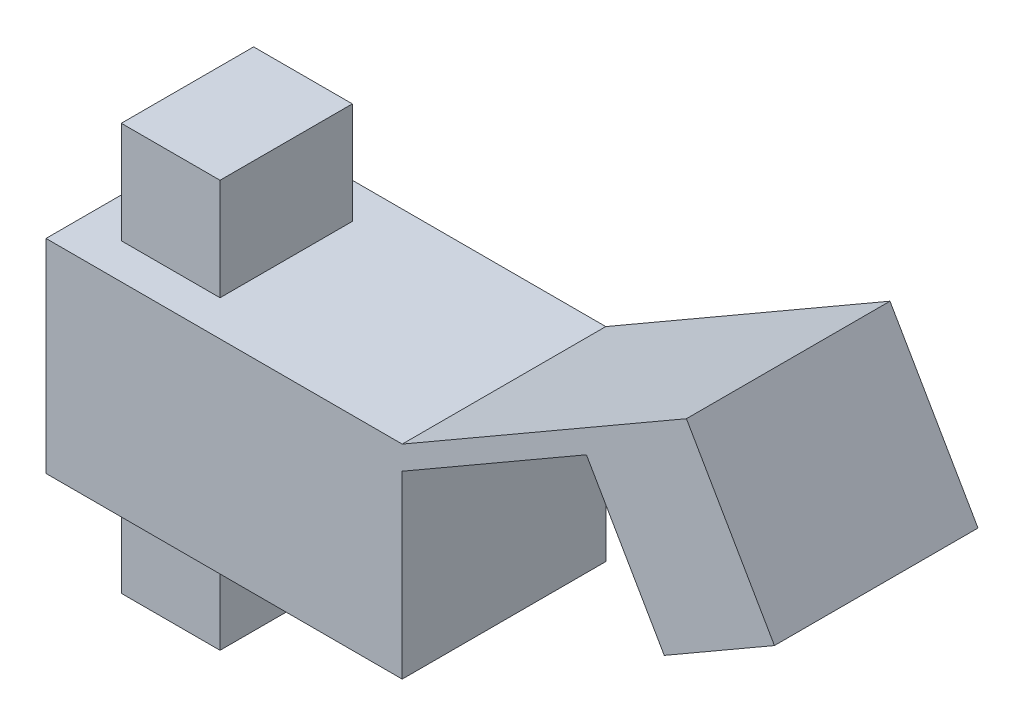
ISO-10303-21;
HEADER;
FILE_DESCRIPTION(('STEP AP214'),'2;1');
FILE_NAME('part.step','',(''),(''),'','','');
FILE_SCHEMA(('AUTOMOTIVE_DESIGN { 1 0 10303 214 1 1 1 1 }'));
ENDSEC;
DATA;
#1=APPLICATION_CONTEXT('core data for automotive mechanical design processes');
#2=APPLICATION_PROTOCOL_DEFINITION('international standard','automotive_design',2000,#1);
#3=PRODUCT_CONTEXT('',#1,'mechanical');
#4=PRODUCT('Part','Part','',(#3));
#5=PRODUCT_RELATED_PRODUCT_CATEGORY('part','',(#4));
#6=PRODUCT_DEFINITION_FORMATION('','',#4);
#7=PRODUCT_DEFINITION_CONTEXT('part definition',#1,'design');
#8=PRODUCT_DEFINITION('design','',#6,#7);
#9=PRODUCT_DEFINITION_SHAPE('','',#8);
#10=(LENGTH_UNIT() NAMED_UNIT(*) SI_UNIT(.MILLI.,.METRE.));
#11=(NAMED_UNIT(*) PLANE_ANGLE_UNIT() SI_UNIT($,.RADIAN.));
#12=(NAMED_UNIT(*) SI_UNIT($,.STERADIAN.) SOLID_ANGLE_UNIT());
#13=UNCERTAINTY_MEASURE_WITH_UNIT(LENGTH_MEASURE(1.E-05),#10,'distance_accuracy_value','');
#14=(GEOMETRIC_REPRESENTATION_CONTEXT(3) GLOBAL_UNCERTAINTY_ASSIGNED_CONTEXT((#13)) GLOBAL_UNIT_ASSIGNED_CONTEXT((#10,
#11,#12)) REPRESENTATION_CONTEXT('',''));
#15=CARTESIAN_POINT('',(0.,0.,0.));
#16=DIRECTION('',(0.,0.,1.));
#17=DIRECTION('',(1.,0.,0.));
#18=AXIS2_PLACEMENT_3D('',#15,#16,#17);
#19=CARTESIAN_POINT('',(80.7217258097532,47.4923817541903,20.));
#20=DIRECTION('',(-0.500000000000005,0.866025403784436,0.));
#21=DIRECTION('',(-0.866025403784436,-0.500000000000005,0.));
#22=AXIS2_PLACEMENT_3D('',#19,#20,#21);
#23=PLANE('',#22);
#24=DIRECTION('',(0.866025403784436,0.500000000000005,0.));
#25=VECTOR('',#24,1.);
#26=CARTESIAN_POINT('',(80.7217258097532,47.4923817541903,-20.));
#27=LINE('',#26,#25);
#28=CARTESIAN_POINT('',(80.7217258097532,47.4923817541903,-20.));
#29=VERTEX_POINT('',#28);
#30=CARTESIAN_POINT('',(102.372360904364,59.9923817541904,-20.));
#31=VERTEX_POINT('',#30);
#32=EDGE_CURVE('E365',#29,#31,#27,.T.);
#33=ORIENTED_EDGE('',*,*,#32,.T.);
#34=DIRECTION('',(0.,0.,-1.));
#35=VECTOR('',#34,1.);
#36=CARTESIAN_POINT('',(102.372360904364,59.9923817541904,20.));
#37=LINE('',#36,#35);
#38=CARTESIAN_POINT('',(102.372360904364,59.9923817541904,20.));
#39=VERTEX_POINT('',#38);
#40=EDGE_CURVE('E427',#39,#31,#37,.T.);
#41=ORIENTED_EDGE('',*,*,#40,.F.);
#42=DIRECTION('',(0.866025403784436,0.500000000000005,0.));
#43=VECTOR('',#42,1.);
#44=CARTESIAN_POINT('',(80.7217258097532,47.4923817541903,20.));
#45=LINE('',#44,#43);
#46=CARTESIAN_POINT('',(80.7217258097532,47.4923817541903,20.));
#47=VERTEX_POINT('',#46);
#48=EDGE_CURVE('E366',#47,#39,#45,.T.);
#49=ORIENTED_EDGE('',*,*,#48,.F.);
#50=DIRECTION('',(0.,0.,-1.));
#51=VECTOR('',#50,1.);
#52=CARTESIAN_POINT('',(80.7217258097532,47.4923817541903,20.));
#53=LINE('',#52,#51);
#54=EDGE_CURVE('E386',#47,#29,#53,.T.);
#55=ORIENTED_EDGE('',*,*,#54,.T.);
#56=EDGE_LOOP('',(#33,#41,#49,#55));
#57=FACE_BOUND('',#56,.T.);
#58=ADVANCED_FACE('F40',(#57),#23,.F.);
#59=CARTESIAN_POINT('',(85.0749116051828,89.9524427817186,20.));
#60=DIRECTION('',(-0.866025403784436,-0.500000000000004,0.));
#61=DIRECTION('',(0.500000000000004,-0.866025403784436,0.));
#62=AXIS2_PLACEMENT_3D('',#59,#60,#61);
#63=PLANE('',#62);
#64=DIRECTION('',(-0.500000000000004,0.866025403784436,0.));
#65=VECTOR('',#64,1.);
#66=CARTESIAN_POINT('',(85.0749116051828,89.9524427817186,-20.));
#67=LINE('',#66,#65);
#68=CARTESIAN_POINT('',(85.0749116051828,89.9524427817186,-20.));
#69=VERTEX_POINT('',#68);
#70=EDGE_CURVE('E389',#31,#69,#67,.T.);
#71=ORIENTED_EDGE('',*,*,#70,.T.);
#72=DIRECTION('',(0.,0.,-1.));
#73=VECTOR('',#72,1.);
#74=CARTESIAN_POINT('',(85.0749116051828,89.9524427817186,20.));
#75=LINE('',#74,#73);
#76=CARTESIAN_POINT('',(85.0749116051828,89.9524427817186,20.));
#77=VERTEX_POINT('',#76);
#78=EDGE_CURVE('E424',#77,#69,#75,.T.);
#79=ORIENTED_EDGE('',*,*,#78,.F.);
#80=DIRECTION('',(-0.500000000000004,0.866025403784436,0.));
#81=VECTOR('',#80,1.);
#82=CARTESIAN_POINT('',(85.0749116051828,89.9524427817186,20.));
#83=LINE('',#82,#81);
#84=EDGE_CURVE('E369',#39,#77,#83,.T.);
#85=ORIENTED_EDGE('',*,*,#84,.F.);
#86=ORIENTED_EDGE('',*,*,#40,.T.);
#87=EDGE_LOOP('',(#71,#79,#85,#86));
#88=FACE_BOUND('',#87,.T.);
#89=ADVANCED_FACE('F547',(#88),#63,.F.);
#90=CARTESIAN_POINT('',(29.2268879668804,57.7085713004357,20.));
#91=DIRECTION('',(0.500000000000004,-0.866025403784436,0.));
#92=DIRECTION('',(0.866025403784436,0.500000000000004,0.));
#93=AXIS2_PLACEMENT_3D('',#90,#91,#92);
#94=PLANE('',#93);
#95=DIRECTION('',(-0.866025403784436,-0.500000000000004,0.));
#96=VECTOR('',#95,1.);
#97=CARTESIAN_POINT('',(29.2268879668804,57.7085713004357,-20.));
#98=LINE('',#97,#96);
#99=CARTESIAN_POINT('',(29.2268879668804,57.7085713004357,-20.));
#100=VERTEX_POINT('',#99);
#101=EDGE_CURVE('E391',#69,#100,#98,.T.);
#102=ORIENTED_EDGE('',*,*,#101,.T.);
#103=DIRECTION('',(0.,0.,-1.));
#104=VECTOR('',#103,1.);
#105=CARTESIAN_POINT('',(29.2268879668804,57.7085713004357,20.));
#106=LINE('',#105,#104);
#107=CARTESIAN_POINT('',(29.2268879668804,57.7085713004357,20.));
#108=VERTEX_POINT('',#107);
#109=EDGE_CURVE('E421',#108,#100,#106,.T.);
#110=ORIENTED_EDGE('',*,*,#109,.F.);
#111=DIRECTION('',(-0.866025403784436,-0.500000000000004,0.));
#112=VECTOR('',#111,1.);
#113=CARTESIAN_POINT('',(29.2268879668804,57.7085713004357,20.));
#114=LINE('',#113,#112);
#115=EDGE_CURVE('E372',#77,#108,#114,.T.);
#116=ORIENTED_EDGE('',*,*,#115,.F.);
#117=ORIENTED_EDGE('',*,*,#78,.T.);
#118=EDGE_LOOP('',(#102,#110,#116,#117));
#119=FACE_BOUND('',#118,.T.);
#120=ADVANCED_FACE('F544',(#119),#94,.F.);
#121=CARTESIAN_POINT('',(29.2268879668804,57.7085713004357,20.));
#122=DIRECTION('',(0.,-1.,0.));
#123=DIRECTION('',(0.,0.,-1.));
#124=AXIS2_PLACEMENT_3D('',#121,#122,#123);
#125=PLANE('',#124);
#126=DIRECTION('',(-1.,0.,0.));
#127=VECTOR('',#126,1.);
#128=CARTESIAN_POINT('',(29.2268879668804,57.7085713004357,13.));
#129=LINE('',#128,#127);
#130=CARTESIAN_POINT('',(-13.5748655969921,57.7085713004357,13.));
#131=VERTEX_POINT('',#130);
#132=CARTESIAN_POINT('',(-32.9713584692472,57.7085713004357,13.));
#133=VERTEX_POINT('',#132);
#134=EDGE_CURVE('E342',#131,#133,#129,.T.);
#135=ORIENTED_EDGE('',*,*,#134,.T.);
#136=DIRECTION('',(0.,0.,-1.));
#137=VECTOR('',#136,1.);
#138=CARTESIAN_POINT('',(-32.9713584692472,57.7085713004357,20.));
#139=LINE('',#138,#137);
#140=CARTESIAN_POINT('',(-32.9713584692472,57.7085713004357,-13.));
#141=VERTEX_POINT('',#140);
#142=EDGE_CURVE('E362',#133,#141,#139,.T.);
#143=ORIENTED_EDGE('',*,*,#142,.T.);
#144=DIRECTION('',(1.,0.,0.));
#145=VECTOR('',#144,1.);
#146=CARTESIAN_POINT('',(29.2268879668804,57.7085713004357,-13.));
#147=LINE('',#146,#145);
#148=CARTESIAN_POINT('',(-13.5748655969921,57.7085713004357,-13.));
#149=VERTEX_POINT('',#148);
#150=EDGE_CURVE('E359',#141,#149,#147,.T.);
#151=ORIENTED_EDGE('',*,*,#150,.T.);
#152=DIRECTION('',(0.,0.,1.));
#153=VECTOR('',#152,1.);
#154=CARTESIAN_POINT('',(-13.5748655969921,57.7085713004357,20.));
#155=LINE('',#154,#153);
#156=EDGE_CURVE('E356',#149,#131,#155,.T.);
#157=ORIENTED_EDGE('',*,*,#156,.T.);
#158=EDGE_LOOP('',(#135,#143,#151,#157));
#159=FACE_BOUND('',#158,.T.);
#160=DIRECTION('',(-1.,0.,0.));
#161=VECTOR('',#160,1.);
#162=CARTESIAN_POINT('',(29.2268879668804,57.7085713004357,-20.));
#163=LINE('',#162,#161);
#164=CARTESIAN_POINT('',(-40.7731120331197,57.7085713004357,-20.));
#165=VERTEX_POINT('',#164);
#166=EDGE_CURVE('E393',#100,#165,#163,.T.);
#167=ORIENTED_EDGE('',*,*,#166,.T.);
#168=DIRECTION('',(0.,0.,-1.));
#169=VECTOR('',#168,1.);
#170=CARTESIAN_POINT('',(-40.7731120331197,57.7085713004357,20.));
#171=LINE('',#170,#169);
#172=CARTESIAN_POINT('',(-40.7731120331197,57.7085713004357,20.));
#173=VERTEX_POINT('',#172);
#174=EDGE_CURVE('E418',#173,#165,#171,.T.);
#175=ORIENTED_EDGE('',*,*,#174,.F.);
#176=DIRECTION('',(-1.,0.,0.));
#177=VECTOR('',#176,1.);
#178=CARTESIAN_POINT('',(29.2268879668804,57.7085713004357,20.));
#179=LINE('',#178,#177);
#180=EDGE_CURVE('E374',#108,#173,#179,.T.);
#181=ORIENTED_EDGE('',*,*,#180,.F.);
#182=ORIENTED_EDGE('',*,*,#109,.T.);
#183=EDGE_LOOP('',(#167,#175,#181,#182));
#184=FACE_BOUND('',#183,.T.);
#185=ADVANCED_FACE('F540',(#159,#184),#125,.F.);
#186=CARTESIAN_POINT('',(-40.7731120331197,57.7085713004357,20.));
#187=DIRECTION('',(1.,0.,0.));
#188=DIRECTION('',(0.,1.,0.));
#189=AXIS2_PLACEMENT_3D('',#186,#187,#188);
#190=PLANE('',#189);
#191=DIRECTION('',(0.,-1.,0.));
#192=VECTOR('',#191,1.);
#193=CARTESIAN_POINT('',(-40.7731120331197,57.7085713004357,-20.));
#194=LINE('',#193,#192);
#195=CARTESIAN_POINT('',(-40.7731120331196,17.7085713004357,-20.));
#196=VERTEX_POINT('',#195);
#197=EDGE_CURVE('E395',#165,#196,#194,.T.);
#198=ORIENTED_EDGE('',*,*,#197,.T.);
#199=DIRECTION('',(0.,0.,-1.));
#200=VECTOR('',#199,1.);
#201=CARTESIAN_POINT('',(-40.7731120331196,17.7085713004357,20.));
#202=LINE('',#201,#200);
#203=CARTESIAN_POINT('',(-40.7731120331196,17.7085713004357,20.));
#204=VERTEX_POINT('',#203);
#205=EDGE_CURVE('E415',#204,#196,#202,.T.);
#206=ORIENTED_EDGE('',*,*,#205,.F.);
#207=DIRECTION('',(0.,-1.,0.));
#208=VECTOR('',#207,1.);
#209=CARTESIAN_POINT('',(-40.7731120331197,57.7085713004357,20.));
#210=LINE('',#209,#208);
#211=EDGE_CURVE('E376',#173,#204,#210,.T.);
#212=ORIENTED_EDGE('',*,*,#211,.F.);
#213=ORIENTED_EDGE('',*,*,#174,.T.);
#214=EDGE_LOOP('',(#198,#206,#212,#213));
#215=FACE_BOUND('',#214,.T.);
#216=ADVANCED_FACE('F536',(#215),#190,.F.);
#217=CARTESIAN_POINT('',(-40.7731120331196,17.7085713004357,20.));
#218=DIRECTION('',(0.,1.,0.));
#219=DIRECTION('',(-1.,0.,0.));
#220=AXIS2_PLACEMENT_3D('',#217,#218,#219);
#221=PLANE('',#220);
#222=DIRECTION('',(-1.,0.,0.));
#223=VECTOR('',#222,1.);
#224=CARTESIAN_POINT('',(-40.7731120331196,17.7085713004357,-13.));
#225=LINE('',#224,#223);
#226=CARTESIAN_POINT('',(-13.5748655969921,17.7085713004358,-13.));
#227=VERTEX_POINT('',#226);
#228=CARTESIAN_POINT('',(-32.9713584692472,17.7085713004357,-13.));
#229=VERTEX_POINT('',#228);
#230=EDGE_CURVE('E436',#227,#229,#225,.T.);
#231=ORIENTED_EDGE('',*,*,#230,.T.);
#232=DIRECTION('',(0.,0.,1.));
#233=VECTOR('',#232,1.);
#234=CARTESIAN_POINT('',(-32.9713584692472,17.7085713004357,20.));
#235=LINE('',#234,#233);
#236=CARTESIAN_POINT('',(-32.9713584692472,17.7085713004357,13.));
#237=VERTEX_POINT('',#236);
#238=EDGE_CURVE('E439',#229,#237,#235,.T.);
#239=ORIENTED_EDGE('',*,*,#238,.T.);
#240=DIRECTION('',(1.,0.,0.));
#241=VECTOR('',#240,1.);
#242=CARTESIAN_POINT('',(-40.7731120331196,17.7085713004357,13.));
#243=LINE('',#242,#241);
#244=CARTESIAN_POINT('',(-13.5748655969921,17.7085713004358,13.));
#245=VERTEX_POINT('',#244);
#246=EDGE_CURVE('E430',#237,#245,#243,.T.);
#247=ORIENTED_EDGE('',*,*,#246,.T.);
#248=DIRECTION('',(0.,0.,-1.));
#249=VECTOR('',#248,1.);
#250=CARTESIAN_POINT('',(-13.5748655969921,17.7085713004358,20.));
#251=LINE('',#250,#249);
#252=EDGE_CURVE('E433',#245,#227,#251,.T.);
#253=ORIENTED_EDGE('',*,*,#252,.T.);
#254=EDGE_LOOP('',(#231,#239,#247,#253));
#255=FACE_BOUND('',#254,.T.);
#256=DIRECTION('',(1.,0.,0.));
#257=VECTOR('',#256,1.);
#258=CARTESIAN_POINT('',(-40.7731120331196,17.7085713004357,-20.));
#259=LINE('',#258,#257);
#260=CARTESIAN_POINT('',(29.2268879668804,17.7085713004358,-20.));
#261=VERTEX_POINT('',#260);
#262=EDGE_CURVE('E397',#196,#261,#259,.T.);
#263=ORIENTED_EDGE('',*,*,#262,.T.);
#264=DIRECTION('',(0.,0.,-1.));
#265=VECTOR('',#264,1.);
#266=CARTESIAN_POINT('',(29.2268879668804,17.7085713004358,20.));
#267=LINE('',#266,#265);
#268=CARTESIAN_POINT('',(29.2268879668804,17.7085713004358,20.));
#269=VERTEX_POINT('',#268);
#270=EDGE_CURVE('E412',#269,#261,#267,.T.);
#271=ORIENTED_EDGE('',*,*,#270,.F.);
#272=DIRECTION('',(1.,0.,0.));
#273=VECTOR('',#272,1.);
#274=CARTESIAN_POINT('',(-40.7731120331196,17.7085713004357,20.));
#275=LINE('',#274,#273);
#276=EDGE_CURVE('E378',#204,#269,#275,.T.);
#277=ORIENTED_EDGE('',*,*,#276,.F.);
#278=ORIENTED_EDGE('',*,*,#205,.T.);
#279=EDGE_LOOP('',(#263,#271,#277,#278));
#280=FACE_BOUND('',#279,.T.);
#281=ADVANCED_FACE('F532',(#255,#280),#221,.F.);
#282=CARTESIAN_POINT('',(29.2268879668804,17.7085713004358,20.));
#283=DIRECTION('',(-1.,0.,0.));
#284=DIRECTION('',(0.,0.,1.));
#285=AXIS2_PLACEMENT_3D('',#282,#283,#284);
#286=PLANE('',#285);
#287=DIRECTION('',(0.,1.,0.));
#288=VECTOR('',#287,1.);
#289=CARTESIAN_POINT('',(29.2268879668804,17.7085713004358,-20.));
#290=LINE('',#289,#288);
#291=CARTESIAN_POINT('',(29.2268879668804,53.0897691469187,-20.));
#292=VERTEX_POINT('',#291);
#293=EDGE_CURVE('E399',#261,#292,#290,.T.);
#294=ORIENTED_EDGE('',*,*,#293,.T.);
#295=DIRECTION('',(0.,0.,-1.));
#296=VECTOR('',#295,1.);
#297=CARTESIAN_POINT('',(29.2268879668804,53.0897691469187,20.));
#298=LINE('',#297,#296);
#299=CARTESIAN_POINT('',(29.2268879668804,53.0897691469187,20.));
#300=VERTEX_POINT('',#299);
#301=EDGE_CURVE('E409',#300,#292,#298,.T.);
#302=ORIENTED_EDGE('',*,*,#301,.F.);
#303=DIRECTION('',(0.,1.,0.));
#304=VECTOR('',#303,1.);
#305=CARTESIAN_POINT('',(29.2268879668804,17.7085713004358,20.));
#306=LINE('',#305,#304);
#307=EDGE_CURVE('E380',#269,#300,#306,.T.);
#308=ORIENTED_EDGE('',*,*,#307,.F.);
#309=ORIENTED_EDGE('',*,*,#270,.T.);
#310=EDGE_LOOP('',(#294,#302,#308,#309));
#311=FACE_BOUND('',#310,.T.);
#312=ADVANCED_FACE('F528',(#311),#286,.F.);
#313=CARTESIAN_POINT('',(29.2268879668804,53.0897691469187,20.));
#314=DIRECTION('',(-0.5,0.866025403784439,0.));
#315=DIRECTION('',(-0.866025403784439,-0.5,0.));
#316=AXIS2_PLACEMENT_3D('',#313,#314,#315);
#317=PLANE('',#316);
#318=DIRECTION('',(0.866025403784439,0.5,0.));
#319=VECTOR('',#318,1.);
#320=CARTESIAN_POINT('',(29.2268879668804,53.0897691469187,-20.));
#321=LINE('',#320,#319);
#322=CARTESIAN_POINT('',(65.424276510572,73.9883411665806,-20.));
#323=VERTEX_POINT('',#322);
#324=EDGE_CURVE('E401',#292,#323,#321,.T.);
#325=ORIENTED_EDGE('',*,*,#324,.T.);
#326=DIRECTION('',(0.,0.,-1.));
#327=VECTOR('',#326,1.);
#328=CARTESIAN_POINT('',(65.424276510572,73.9883411665806,20.));
#329=LINE('',#328,#327);
#330=CARTESIAN_POINT('',(65.424276510572,73.9883411665806,20.));
#331=VERTEX_POINT('',#330);
#332=EDGE_CURVE('E406',#331,#323,#329,.T.);
#333=ORIENTED_EDGE('',*,*,#332,.F.);
#334=DIRECTION('',(0.866025403784439,0.5,0.));
#335=VECTOR('',#334,1.);
#336=CARTESIAN_POINT('',(29.2268879668804,53.0897691469187,20.));
#337=LINE('',#336,#335);
#338=EDGE_CURVE('E382',#300,#331,#337,.T.);
#339=ORIENTED_EDGE('',*,*,#338,.F.);
#340=ORIENTED_EDGE('',*,*,#301,.T.);
#341=EDGE_LOOP('',(#325,#333,#339,#340));
#342=FACE_BOUND('',#341,.T.);
#343=ADVANCED_FACE('F524',(#342),#317,.F.);
#344=CARTESIAN_POINT('',(65.424276510572,73.9883411665806,20.));
#345=DIRECTION('',(0.866025403784435,0.500000000000006,0.));
#346=DIRECTION('',(-0.500000000000006,0.866025403784435,0.));
#347=AXIS2_PLACEMENT_3D('',#344,#345,#346);
#348=PLANE('',#347);
#349=DIRECTION('',(0.500000000000006,-0.866025403784435,0.));
#350=VECTOR('',#349,1.);
#351=CARTESIAN_POINT('',(65.424276510572,73.9883411665806,-20.));
#352=LINE('',#351,#350);
#353=EDGE_CURVE('E370',#323,#29,#352,.T.);
#354=ORIENTED_EDGE('',*,*,#353,.T.);
#355=ORIENTED_EDGE('',*,*,#54,.F.);
#356=DIRECTION('',(0.500000000000006,-0.866025403784435,0.));
#357=VECTOR('',#356,1.);
#358=CARTESIAN_POINT('',(65.424276510572,73.9883411665806,20.));
#359=LINE('',#358,#357);
#360=EDGE_CURVE('E384',#331,#47,#359,.T.);
#361=ORIENTED_EDGE('',*,*,#360,.F.);
#362=ORIENTED_EDGE('',*,*,#332,.T.);
#363=EDGE_LOOP('',(#354,#355,#361,#362));
#364=FACE_BOUND('',#363,.T.);
#365=ADVANCED_FACE('F517',(#364),#348,.F.);
#366=CARTESIAN_POINT('',(0.,0.,20.));
#367=DIRECTION('',(0.,0.,-1.));
#368=DIRECTION('',(-1.,0.,0.));
#369=AXIS2_PLACEMENT_3D('',#366,#367,#368);
#370=PLANE('',#369);
#371=ORIENTED_EDGE('',*,*,#48,.T.);
#372=ORIENTED_EDGE('',*,*,#84,.T.);
#373=ORIENTED_EDGE('',*,*,#115,.T.);
#374=ORIENTED_EDGE('',*,*,#180,.T.);
#375=ORIENTED_EDGE('',*,*,#211,.T.);
#376=ORIENTED_EDGE('',*,*,#276,.T.);
#377=ORIENTED_EDGE('',*,*,#307,.T.);
#378=ORIENTED_EDGE('',*,*,#338,.T.);
#379=ORIENTED_EDGE('',*,*,#360,.T.);
#380=EDGE_LOOP('',(#371,#372,#373,#374,#375,#376,#377,#378,#379));
#381=FACE_BOUND('',#380,.T.);
#382=ADVANCED_FACE('F514',(#381),#370,.F.);
#383=CARTESIAN_POINT('',(0.,0.,-20.));
#384=DIRECTION('',(0.,0.,-1.));
#385=DIRECTION('',(-1.,0.,0.));
#386=AXIS2_PLACEMENT_3D('',#383,#384,#385);
#387=PLANE('',#386);
#388=ORIENTED_EDGE('',*,*,#32,.F.);
#389=ORIENTED_EDGE('',*,*,#353,.F.);
#390=ORIENTED_EDGE('',*,*,#324,.F.);
#391=ORIENTED_EDGE('',*,*,#293,.F.);
#392=ORIENTED_EDGE('',*,*,#262,.F.);
#393=ORIENTED_EDGE('',*,*,#197,.F.);
#394=ORIENTED_EDGE('',*,*,#166,.F.);
#395=ORIENTED_EDGE('',*,*,#101,.F.);
#396=ORIENTED_EDGE('',*,*,#70,.F.);
#397=EDGE_LOOP('',(#388,#389,#390,#391,#392,#393,#394,#395,#396));
#398=FACE_BOUND('',#397,.T.);
#399=ADVANCED_FACE('F494',(#398),#387,.T.);
#400=CARTESIAN_POINT('',(0.,-2.29142869956425,0.));
#401=DIRECTION('',(0.,1.,0.));
#402=DIRECTION('',(0.,0.,1.));
#403=AXIS2_PLACEMENT_3D('',#400,#401,#402);
#404=PLANE('',#403);
#405=DIRECTION('',(0.,0.,1.));
#406=VECTOR('',#405,1.);
#407=CARTESIAN_POINT('',(-32.9713584692472,-2.29142869956425,20.));
#408=LINE('',#407,#406);
#409=CARTESIAN_POINT('',(-32.9713584692472,-2.29142869956425,-13.));
#410=VERTEX_POINT('',#409);
#411=CARTESIAN_POINT('',(-32.9713584692472,-2.29142869956425,13.));
#412=VERTEX_POINT('',#411);
#413=EDGE_CURVE('E326',#410,#412,#408,.T.);
#414=ORIENTED_EDGE('',*,*,#413,.F.);
#415=DIRECTION('',(-1.,0.,0.));
#416=VECTOR('',#415,1.);
#417=CARTESIAN_POINT('',(29.2268879668804,-2.29142869956425,-13.));
#418=LINE('',#417,#416);
#419=CARTESIAN_POINT('',(-13.5748655969921,-2.29142869956425,-13.));
#420=VERTEX_POINT('',#419);
#421=EDGE_CURVE('E335',#420,#410,#418,.T.);
#422=ORIENTED_EDGE('',*,*,#421,.F.);
#423=DIRECTION('',(0.,0.,-1.));
#424=VECTOR('',#423,1.);
#425=CARTESIAN_POINT('',(-13.5748655969921,-2.29142869956425,20.));
#426=LINE('',#425,#424);
#427=CARTESIAN_POINT('',(-13.5748655969921,-2.29142869956425,13.));
#428=VERTEX_POINT('',#427);
#429=EDGE_CURVE('E332',#428,#420,#426,.T.);
#430=ORIENTED_EDGE('',*,*,#429,.F.);
#431=DIRECTION('',(1.,0.,0.));
#432=VECTOR('',#431,1.);
#433=CARTESIAN_POINT('',(29.2268879668804,-2.29142869956425,13.));
#434=LINE('',#433,#432);
#435=EDGE_CURVE('E329',#412,#428,#434,.T.);
#436=ORIENTED_EDGE('',*,*,#435,.F.);
#437=EDGE_LOOP('',(#414,#422,#430,#436));
#438=FACE_BOUND('',#437,.T.);
#439=ADVANCED_FACE('F490',(#438),#404,.F.);
#440=CARTESIAN_POINT('',(29.2268879668804,-2.29142869956425,13.));
#441=DIRECTION('',(0.,0.,1.));
#442=DIRECTION('',(1.,0.,0.));
#443=AXIS2_PLACEMENT_3D('',#440,#441,#442);
#444=PLANE('',#443);
#445=ORIENTED_EDGE('',*,*,#246,.F.);
#446=DIRECTION('',(0.,1.,0.));
#447=VECTOR('',#446,1.);
#448=CARTESIAN_POINT('',(-32.9713584692472,-2.29142869956425,13.));
#449=LINE('',#448,#447);
#450=EDGE_CURVE('E351',#412,#237,#449,.T.);
#451=ORIENTED_EDGE('',*,*,#450,.F.);
#452=ORIENTED_EDGE('',*,*,#435,.T.);
#453=DIRECTION('',(0.,1.,0.));
#454=VECTOR('',#453,1.);
#455=CARTESIAN_POINT('',(-13.5748655969921,-2.29142869956425,13.));
#456=LINE('',#455,#454);
#457=EDGE_CURVE('E348',#428,#245,#456,.T.);
#458=ORIENTED_EDGE('',*,*,#457,.T.);
#459=EDGE_LOOP('',(#445,#451,#452,#458));
#460=FACE_BOUND('',#459,.T.);
#461=ADVANCED_FACE('F493',(#460),#444,.T.);
#462=CARTESIAN_POINT('',(-13.5748655969921,-2.29142869956425,20.));
#463=DIRECTION('',(1.,0.,0.));
#464=DIRECTION('',(0.,1.,0.));
#465=AXIS2_PLACEMENT_3D('',#462,#463,#464);
#466=PLANE('',#465);
#467=ORIENTED_EDGE('',*,*,#252,.F.);
#468=ORIENTED_EDGE('',*,*,#457,.F.);
#469=ORIENTED_EDGE('',*,*,#429,.T.);
#470=DIRECTION('',(0.,1.,0.));
#471=VECTOR('',#470,1.);
#472=CARTESIAN_POINT('',(-13.5748655969921,-2.29142869956425,-13.));
#473=LINE('',#472,#471);
#474=EDGE_CURVE('E344',#420,#227,#473,.T.);
#475=ORIENTED_EDGE('',*,*,#474,.T.);
#476=EDGE_LOOP('',(#467,#468,#469,#475));
#477=FACE_BOUND('',#476,.T.);
#478=ADVANCED_FACE('F506',(#477),#466,.T.);
#479=CARTESIAN_POINT('',(29.2268879668804,-2.29142869956425,-13.));
#480=DIRECTION('',(0.,0.,-1.));
#481=DIRECTION('',(-1.,0.,0.));
#482=AXIS2_PLACEMENT_3D('',#479,#480,#481);
#483=PLANE('',#482);
#484=ORIENTED_EDGE('',*,*,#230,.F.);
#485=ORIENTED_EDGE('',*,*,#474,.F.);
#486=ORIENTED_EDGE('',*,*,#421,.T.);
#487=DIRECTION('',(0.,1.,0.));
#488=VECTOR('',#487,1.);
#489=CARTESIAN_POINT('',(-32.9713584692472,-2.29142869956425,-13.));
#490=LINE('',#489,#488);
#491=EDGE_CURVE('E339',#410,#229,#490,.T.);
#492=ORIENTED_EDGE('',*,*,#491,.T.);
#493=EDGE_LOOP('',(#484,#485,#486,#492));
#494=FACE_BOUND('',#493,.T.);
#495=ADVANCED_FACE('F502',(#494),#483,.T.);
#496=CARTESIAN_POINT('',(-32.9713584692472,-2.29142869956425,20.));
#497=DIRECTION('',(-1.,0.,0.));
#498=DIRECTION('',(0.,-1.,0.));
#499=AXIS2_PLACEMENT_3D('',#496,#497,#498);
#500=PLANE('',#499);
#501=ORIENTED_EDGE('',*,*,#238,.F.);
#502=ORIENTED_EDGE('',*,*,#491,.F.);
#503=ORIENTED_EDGE('',*,*,#413,.T.);
#504=ORIENTED_EDGE('',*,*,#450,.T.);
#505=EDGE_LOOP('',(#501,#502,#503,#504));
#506=FACE_BOUND('',#505,.T.);
#507=ADVANCED_FACE('F512',(#506),#500,.T.);
#508=ORIENTED_EDGE('',*,*,#142,.F.);
#509=CARTESIAN_POINT('',(-32.9713584692472,77.7085713004358,13.));
#510=VERTEX_POINT('',#509);
#511=EDGE_CURVE('E338',#133,#510,#449,.T.);
#512=ORIENTED_EDGE('',*,*,#511,.T.);
#513=DIRECTION('',(0.,0.,1.));
#514=VECTOR('',#513,1.);
#515=CARTESIAN_POINT('',(-32.9713584692472,77.7085713004358,20.));
#516=LINE('',#515,#514);
#517=CARTESIAN_POINT('',(-32.9713584692472,77.7085713004358,-13.));
#518=VERTEX_POINT('',#517);
#519=EDGE_CURVE('E314',#518,#510,#516,.T.);
#520=ORIENTED_EDGE('',*,*,#519,.F.);
#521=EDGE_CURVE('E343',#141,#518,#490,.T.);
#522=ORIENTED_EDGE('',*,*,#521,.F.);
#523=EDGE_LOOP('',(#508,#512,#520,#522));
#524=FACE_BOUND('',#523,.T.);
#525=ADVANCED_FACE('F500',(#524),#500,.T.);
#526=ORIENTED_EDGE('',*,*,#150,.F.);
#527=ORIENTED_EDGE('',*,*,#521,.T.);
#528=DIRECTION('',(-1.,0.,0.));
#529=VECTOR('',#528,1.);
#530=CARTESIAN_POINT('',(29.2268879668804,77.7085713004358,-13.));
#531=LINE('',#530,#529);
#532=CARTESIAN_POINT('',(-13.5748655969921,77.7085713004358,-13.));
#533=VERTEX_POINT('',#532);
#534=EDGE_CURVE('E323',#533,#518,#531,.T.);
#535=ORIENTED_EDGE('',*,*,#534,.F.);
#536=EDGE_CURVE('E347',#149,#533,#473,.T.);
#537=ORIENTED_EDGE('',*,*,#536,.F.);
#538=EDGE_LOOP('',(#526,#527,#535,#537));
#539=FACE_BOUND('',#538,.T.);
#540=ADVANCED_FACE('F496',(#539),#483,.T.);
#541=ORIENTED_EDGE('',*,*,#156,.F.);
#542=ORIENTED_EDGE('',*,*,#536,.T.);
#543=DIRECTION('',(0.,0.,-1.));
#544=VECTOR('',#543,1.);
#545=CARTESIAN_POINT('',(-13.5748655969921,77.7085713004358,20.));
#546=LINE('',#545,#544);
#547=CARTESIAN_POINT('',(-13.5748655969921,77.7085713004358,13.));
#548=VERTEX_POINT('',#547);
#549=EDGE_CURVE('E320',#548,#533,#546,.T.);
#550=ORIENTED_EDGE('',*,*,#549,.F.);
#551=EDGE_CURVE('E350',#131,#548,#456,.T.);
#552=ORIENTED_EDGE('',*,*,#551,.F.);
#553=EDGE_LOOP('',(#541,#542,#550,#552));
#554=FACE_BOUND('',#553,.T.);
#555=ADVANCED_FACE('F499',(#554),#466,.T.);
#556=ORIENTED_EDGE('',*,*,#134,.F.);
#557=ORIENTED_EDGE('',*,*,#551,.T.);
#558=DIRECTION('',(1.,0.,0.));
#559=VECTOR('',#558,1.);
#560=CARTESIAN_POINT('',(29.2268879668804,77.7085713004358,13.));
#561=LINE('',#560,#559);
#562=EDGE_CURVE('E317',#510,#548,#561,.T.);
#563=ORIENTED_EDGE('',*,*,#562,.F.);
#564=ORIENTED_EDGE('',*,*,#511,.F.);
#565=EDGE_LOOP('',(#556,#557,#563,#564));
#566=FACE_BOUND('',#565,.T.);
#567=ADVANCED_FACE('F488',(#566),#444,.T.);
#568=CARTESIAN_POINT('',(0.,77.7085713004358,0.));
#569=DIRECTION('',(0.,1.,0.));
#570=DIRECTION('',(0.,0.,1.));
#571=AXIS2_PLACEMENT_3D('',#568,#569,#570);
#572=PLANE('',#571);
#573=ORIENTED_EDGE('',*,*,#519,.T.);
#574=ORIENTED_EDGE('',*,*,#562,.T.);
#575=ORIENTED_EDGE('',*,*,#549,.T.);
#576=ORIENTED_EDGE('',*,*,#534,.T.);
#577=EDGE_LOOP('',(#573,#574,#575,#576));
#578=FACE_BOUND('',#577,.T.);
#579=ADVANCED_FACE('F486',(#578),#572,.T.);
#580=CLOSED_SHELL('',(#58,#89,#120,#185,#216,#281,#312,#343,#365,#382,#399,#439,#461,#478,#495,
#507,#525,#540,#555,#567,#579));
#581=CARTESIAN_POINT('',(-38.7731120331197,55.7085713004357,18.));
#582=DIRECTION('',(0.,-1.,0.));
#583=DIRECTION('',(0.,0.,-1.));
#584=AXIS2_PLACEMENT_3D('',#581,#582,#583);
#585=PLANE('',#584);
#586=DIRECTION('',(0.,0.,-1.));
#587=VECTOR('',#586,1.);
#588=CARTESIAN_POINT('',(27.2268879668804,55.7085713004357,18.));
#589=LINE('',#588,#587);
#590=CARTESIAN_POINT('',(27.2268879668804,55.7085713004357,18.));
#591=VERTEX_POINT('',#590);
#592=CARTESIAN_POINT('',(27.2268879668804,55.7085713004357,-18.));
#593=VERTEX_POINT('',#592);
#594=EDGE_CURVE('E312',#591,#593,#589,.T.);
#595=ORIENTED_EDGE('',*,*,#594,.F.);
#596=DIRECTION('',(-1.,0.,0.));
#597=VECTOR('',#596,1.);
#598=CARTESIAN_POINT('',(-38.7731120331197,55.7085713004357,18.));
#599=LINE('',#598,#597);
#600=CARTESIAN_POINT('',(-38.7731120331197,55.7085713004357,18.));
#601=VERTEX_POINT('',#600);
#602=EDGE_CURVE('E300',#591,#601,#599,.T.);
#603=ORIENTED_EDGE('',*,*,#602,.T.);
#604=DIRECTION('',(0.,0.,-1.));
#605=VECTOR('',#604,1.);
#606=CARTESIAN_POINT('',(-38.7731120331197,55.7085713004357,18.));
#607=LINE('',#606,#605);
#608=CARTESIAN_POINT('',(-38.7731120331197,55.7085713004357,-18.));
#609=VERTEX_POINT('',#608);
#610=EDGE_CURVE('E310',#601,#609,#607,.T.);
#611=ORIENTED_EDGE('',*,*,#610,.T.);
#612=DIRECTION('',(-1.,0.,0.));
#613=VECTOR('',#612,1.);
#614=CARTESIAN_POINT('',(-38.7731120331197,55.7085713004357,-18.));
#615=LINE('',#614,#613);
#616=EDGE_CURVE('E288',#593,#609,#615,.T.);
#617=ORIENTED_EDGE('',*,*,#616,.F.);
#618=EDGE_LOOP('',(#595,#603,#611,#617));
#619=FACE_BOUND('',#618,.T.);
#620=DIRECTION('',(0.,0.,1.));
#621=VECTOR('',#620,1.);
#622=CARTESIAN_POINT('',(-28.9713584692472,55.7085713004357,18.));
#623=LINE('',#622,#621);
#624=CARTESIAN_POINT('',(-28.9713584692472,55.7085713004357,-9.));
#625=VERTEX_POINT('',#624);
#626=CARTESIAN_POINT('',(-28.9713584692472,55.7085713004357,9.));
#627=VERTEX_POINT('',#626);
#628=EDGE_CURVE('E279',#625,#627,#623,.T.);
#629=ORIENTED_EDGE('',*,*,#628,.T.);
#630=DIRECTION('',(1.,0.,0.));
#631=VECTOR('',#630,1.);
#632=CARTESIAN_POINT('',(-38.7731120331197,55.7085713004357,9.));
#633=LINE('',#632,#631);
#634=CARTESIAN_POINT('',(-17.5748655969921,55.7085713004357,9.));
#635=VERTEX_POINT('',#634);
#636=EDGE_CURVE('E276',#627,#635,#633,.T.);
#637=ORIENTED_EDGE('',*,*,#636,.T.);
#638=DIRECTION('',(0.,0.,-1.));
#639=VECTOR('',#638,1.);
#640=CARTESIAN_POINT('',(-17.5748655969921,55.7085713004357,18.));
#641=LINE('',#640,#639);
#642=CARTESIAN_POINT('',(-17.5748655969921,55.7085713004357,-9.));
#643=VERTEX_POINT('',#642);
#644=EDGE_CURVE('E282',#635,#643,#641,.T.);
#645=ORIENTED_EDGE('',*,*,#644,.T.);
#646=DIRECTION('',(1.,0.,0.));
#647=VECTOR('',#646,1.);
#648=CARTESIAN_POINT('',(-38.7731120331197,55.7085713004357,-9.));
#649=LINE('',#648,#647);
#650=EDGE_CURVE('E242',#625,#643,#649,.T.);
#651=ORIENTED_EDGE('',*,*,#650,.F.);
#652=EDGE_LOOP('',(#629,#637,#645,#651));
#653=FACE_BOUND('',#652,.T.);
#654=ADVANCED_FACE('F465',(#619,#653),#585,.T.);
#655=CARTESIAN_POINT('',(-38.7731120331196,19.7085713004357,18.));
#656=DIRECTION('',(0.,1.,0.));
#657=DIRECTION('',(-1.,0.,0.));
#658=AXIS2_PLACEMENT_3D('',#655,#656,#657);
#659=PLANE('',#658);
#660=DIRECTION('',(0.,0.,-1.));
#661=VECTOR('',#660,1.);
#662=CARTESIAN_POINT('',(-38.7731120331196,19.7085713004357,18.));
#663=LINE('',#662,#661);
#664=CARTESIAN_POINT('',(-38.7731120331196,19.7085713004357,18.));
#665=VERTEX_POINT('',#664);
#666=CARTESIAN_POINT('',(-38.7731120331196,19.7085713004357,-18.));
#667=VERTEX_POINT('',#666);
#668=EDGE_CURVE('E308',#665,#667,#663,.T.);
#669=ORIENTED_EDGE('',*,*,#668,.F.);
#670=DIRECTION('',(1.,0.,0.));
#671=VECTOR('',#670,1.);
#672=CARTESIAN_POINT('',(-38.7731120331196,19.7085713004357,18.));
#673=LINE('',#672,#671);
#674=CARTESIAN_POINT('',(27.2268879668804,19.7085713004358,18.));
#675=VERTEX_POINT('',#674);
#676=EDGE_CURVE('E304',#665,#675,#673,.T.);
#677=ORIENTED_EDGE('',*,*,#676,.T.);
#678=DIRECTION('',(0.,0.,-1.));
#679=VECTOR('',#678,1.);
#680=CARTESIAN_POINT('',(27.2268879668804,19.7085713004358,18.));
#681=LINE('',#680,#679);
#682=CARTESIAN_POINT('',(27.2268879668804,19.7085713004358,-18.));
#683=VERTEX_POINT('',#682);
#684=EDGE_CURVE('E306',#675,#683,#681,.T.);
#685=ORIENTED_EDGE('',*,*,#684,.T.);
#686=DIRECTION('',(1.,0.,0.));
#687=VECTOR('',#686,1.);
#688=CARTESIAN_POINT('',(-38.7731120331196,19.7085713004357,-18.));
#689=LINE('',#688,#687);
#690=EDGE_CURVE('E294',#667,#683,#689,.T.);
#691=ORIENTED_EDGE('',*,*,#690,.F.);
#692=EDGE_LOOP('',(#669,#677,#685,#691));
#693=FACE_BOUND('',#692,.T.);
#694=DIRECTION('',(0.,0.,1.));
#695=VECTOR('',#694,1.);
#696=CARTESIAN_POINT('',(-17.5748655969921,19.7085713004358,18.));
#697=LINE('',#696,#695);
#698=CARTESIAN_POINT('',(-17.5748655969921,19.7085713004358,-9.));
#699=VERTEX_POINT('',#698);
#700=CARTESIAN_POINT('',(-17.5748655969921,19.7085713004357,9.));
#701=VERTEX_POINT('',#700);
#702=EDGE_CURVE('E48',#699,#701,#697,.T.);
#703=ORIENTED_EDGE('',*,*,#702,.T.);
#704=DIRECTION('',(-1.,0.,0.));
#705=VECTOR('',#704,1.);
#706=CARTESIAN_POINT('',(-38.7731120331196,19.7085713004357,9.));
#707=LINE('',#706,#705);
#708=CARTESIAN_POINT('',(-28.9713584692472,19.7085713004357,9.));
#709=VERTEX_POINT('',#708);
#710=EDGE_CURVE('E11',#701,#709,#707,.T.);
#711=ORIENTED_EDGE('',*,*,#710,.T.);
#712=DIRECTION('',(0.,0.,-1.));
#713=VECTOR('',#712,1.);
#714=CARTESIAN_POINT('',(-28.9713584692472,19.7085713004357,18.));
#715=LINE('',#714,#713);
#716=CARTESIAN_POINT('',(-28.9713584692472,19.7085713004357,-9.));
#717=VERTEX_POINT('',#716);
#718=EDGE_CURVE('E444',#709,#717,#715,.T.);
#719=ORIENTED_EDGE('',*,*,#718,.T.);
#720=DIRECTION('',(-1.,0.,0.));
#721=VECTOR('',#720,1.);
#722=CARTESIAN_POINT('',(-38.7731120331196,19.7085713004357,-9.));
#723=LINE('',#722,#721);
#724=EDGE_CURVE('E442',#699,#717,#723,.T.);
#725=ORIENTED_EDGE('',*,*,#724,.F.);
#726=EDGE_LOOP('',(#703,#711,#719,#725));
#727=FACE_BOUND('',#726,.T.);
#728=ADVANCED_FACE('F447',(#693,#727),#659,.T.);
#729=CARTESIAN_POINT('',(27.2268879668804,55.7085713004357,18.));
#730=DIRECTION('',(-1.,0.,0.));
#731=DIRECTION('',(0.,-1.,0.));
#732=AXIS2_PLACEMENT_3D('',#729,#730,#731);
#733=PLANE('',#732);
#734=ORIENTED_EDGE('',*,*,#684,.F.);
#735=DIRECTION('',(0.,1.,0.));
#736=VECTOR('',#735,1.);
#737=CARTESIAN_POINT('',(27.2268879668804,55.7085713004357,18.));
#738=LINE('',#737,#736);
#739=EDGE_CURVE('E297',#675,#591,#738,.T.);
#740=ORIENTED_EDGE('',*,*,#739,.T.);
#741=ORIENTED_EDGE('',*,*,#594,.T.);
#742=DIRECTION('',(0.,1.,0.));
#743=VECTOR('',#742,1.);
#744=CARTESIAN_POINT('',(27.2268879668804,55.7085713004357,-18.));
#745=LINE('',#744,#743);
#746=EDGE_CURVE('E285',#683,#593,#745,.T.);
#747=ORIENTED_EDGE('',*,*,#746,.F.);
#748=EDGE_LOOP('',(#734,#740,#741,#747));
#749=FACE_BOUND('',#748,.T.);
#750=ADVANCED_FACE('F475',(#749),#733,.T.);
#751=CARTESIAN_POINT('',(-38.7731120331197,55.7085713004357,18.));
#752=DIRECTION('',(1.,0.,0.));
#753=DIRECTION('',(0.,1.,0.));
#754=AXIS2_PLACEMENT_3D('',#751,#752,#753);
#755=PLANE('',#754);
#756=ORIENTED_EDGE('',*,*,#610,.F.);
#757=DIRECTION('',(0.,-1.,0.));
#758=VECTOR('',#757,1.);
#759=CARTESIAN_POINT('',(-38.7731120331197,55.7085713004357,18.));
#760=LINE('',#759,#758);
#761=EDGE_CURVE('E302',#601,#665,#760,.T.);
#762=ORIENTED_EDGE('',*,*,#761,.T.);
#763=ORIENTED_EDGE('',*,*,#668,.T.);
#764=DIRECTION('',(0.,-1.,0.));
#765=VECTOR('',#764,1.);
#766=CARTESIAN_POINT('',(-38.7731120331197,55.7085713004357,-18.));
#767=LINE('',#766,#765);
#768=EDGE_CURVE('E291',#609,#667,#767,.T.);
#769=ORIENTED_EDGE('',*,*,#768,.F.);
#770=EDGE_LOOP('',(#756,#762,#763,#769));
#771=FACE_BOUND('',#770,.T.);
#772=ADVANCED_FACE('F482',(#771),#755,.T.);
#773=CARTESIAN_POINT('',(0.,0.,18.));
#774=DIRECTION('',(0.,0.,1.));
#775=DIRECTION('',(1.,0.,0.));
#776=AXIS2_PLACEMENT_3D('',#773,#774,#775);
#777=PLANE('',#776);
#778=ORIENTED_EDGE('',*,*,#739,.F.);
#779=ORIENTED_EDGE('',*,*,#676,.F.);
#780=ORIENTED_EDGE('',*,*,#761,.F.);
#781=ORIENTED_EDGE('',*,*,#602,.F.);
#782=EDGE_LOOP('',(#778,#779,#780,#781));
#783=FACE_BOUND('',#782,.T.);
#784=ADVANCED_FACE('F747',(#783),#777,.F.);
#785=CARTESIAN_POINT('',(0.,0.,-18.));
#786=DIRECTION('',(0.,0.,1.));
#787=DIRECTION('',(1.,0.,0.));
#788=AXIS2_PLACEMENT_3D('',#785,#786,#787);
#789=PLANE('',#788);
#790=ORIENTED_EDGE('',*,*,#746,.T.);
#791=ORIENTED_EDGE('',*,*,#616,.T.);
#792=ORIENTED_EDGE('',*,*,#768,.T.);
#793=ORIENTED_EDGE('',*,*,#690,.T.);
#794=EDGE_LOOP('',(#790,#791,#792,#793));
#795=FACE_BOUND('',#794,.T.);
#796=ADVANCED_FACE('F757',(#795),#789,.T.);
#797=CARTESIAN_POINT('',(-28.9713584692472,1.70857130043575,9.));
#798=DIRECTION('',(0.,1.,0.));
#799=DIRECTION('',(0.,0.,1.));
#800=AXIS2_PLACEMENT_3D('',#797,#798,#799);
#801=PLANE('',#800);
#802=DIRECTION('',(0.,0.,-1.));
#803=VECTOR('',#802,1.);
#804=CARTESIAN_POINT('',(-28.9713584692472,1.70857130043575,9.));
#805=LINE('',#804,#803);
#806=CARTESIAN_POINT('',(-28.9713584692472,1.70857130043575,9.));
#807=VERTEX_POINT('',#806);
#808=CARTESIAN_POINT('',(-28.9713584692472,1.70857130043575,-9.));
#809=VERTEX_POINT('',#808);
#810=EDGE_CURVE('E269',#807,#809,#805,.T.);
#811=ORIENTED_EDGE('',*,*,#810,.F.);
#812=DIRECTION('',(1.,0.,0.));
#813=VECTOR('',#812,1.);
#814=CARTESIAN_POINT('',(-28.9713584692472,1.70857130043575,9.));
#815=LINE('',#814,#813);
#816=CARTESIAN_POINT('',(-17.5748655969921,1.70857130043575,9.));
#817=VERTEX_POINT('',#816);
#818=EDGE_CURVE('E239',#807,#817,#815,.T.);
#819=ORIENTED_EDGE('',*,*,#818,.T.);
#820=DIRECTION('',(0.,0.,-1.));
#821=VECTOR('',#820,1.);
#822=CARTESIAN_POINT('',(-17.5748655969921,1.70857130043575,9.));
#823=LINE('',#822,#821);
#824=CARTESIAN_POINT('',(-17.5748655969921,1.70857130043575,-9.));
#825=VERTEX_POINT('',#824);
#826=EDGE_CURVE('E234',#817,#825,#823,.T.);
#827=ORIENTED_EDGE('',*,*,#826,.T.);
#828=DIRECTION('',(1.,0.,0.));
#829=VECTOR('',#828,1.);
#830=CARTESIAN_POINT('',(-28.9713584692472,1.70857130043575,-9.));
#831=LINE('',#830,#829);
#832=EDGE_CURVE('E237',#809,#825,#831,.T.);
#833=ORIENTED_EDGE('',*,*,#832,.F.);
#834=EDGE_LOOP('',(#811,#819,#827,#833));
#835=FACE_BOUND('',#834,.T.);
#836=ADVANCED_FACE('F236',(#835),#801,.T.);
#837=CARTESIAN_POINT('',(0.,0.,-9.));
#838=DIRECTION('',(0.,0.,-1.));
#839=DIRECTION('',(-1.,0.,0.));
#840=AXIS2_PLACEMENT_3D('',#837,#838,#839);
#841=PLANE('',#840);
#842=ORIENTED_EDGE('',*,*,#724,.T.);
#843=DIRECTION('',(0.,-1.,0.));
#844=VECTOR('',#843,1.);
#845=CARTESIAN_POINT('',(-28.9713584692472,73.7085713004358,-9.));
#846=LINE('',#845,#844);
#847=EDGE_CURVE('E253',#717,#809,#846,.T.);
#848=ORIENTED_EDGE('',*,*,#847,.T.);
#849=ORIENTED_EDGE('',*,*,#832,.T.);
#850=DIRECTION('',(0.,1.,0.));
#851=VECTOR('',#850,1.);
#852=CARTESIAN_POINT('',(-17.5748655969921,73.7085713004358,-9.));
#853=LINE('',#852,#851);
#854=EDGE_CURVE('E63',#825,#699,#853,.T.);
#855=ORIENTED_EDGE('',*,*,#854,.T.);
#856=EDGE_LOOP('',(#842,#848,#849,#855));
#857=FACE_BOUND('',#856,.T.);
#858=ADVANCED_FACE('F251',(#857),#841,.F.);
#859=CARTESIAN_POINT('',(0.,0.,9.));
#860=DIRECTION('',(0.,0.,-1.));
#861=DIRECTION('',(-1.,0.,0.));
#862=AXIS2_PLACEMENT_3D('',#859,#860,#861);
#863=PLANE('',#862);
#864=DIRECTION('',(0.,1.,0.));
#865=VECTOR('',#864,1.);
#866=CARTESIAN_POINT('',(-17.5748655969921,73.7085713004358,9.));
#867=LINE('',#866,#865);
#868=EDGE_CURVE('E261',#817,#701,#867,.T.);
#869=ORIENTED_EDGE('',*,*,#868,.F.);
#870=ORIENTED_EDGE('',*,*,#818,.F.);
#871=DIRECTION('',(0.,-1.,0.));
#872=VECTOR('',#871,1.);
#873=CARTESIAN_POINT('',(-28.9713584692472,73.7085713004358,9.));
#874=LINE('',#873,#872);
#875=EDGE_CURVE('E265',#709,#807,#874,.T.);
#876=ORIENTED_EDGE('',*,*,#875,.F.);
#877=ORIENTED_EDGE('',*,*,#710,.F.);
#878=EDGE_LOOP('',(#869,#870,#876,#877));
#879=FACE_BOUND('',#878,.T.);
#880=ADVANCED_FACE('F452',(#879),#863,.T.);
#881=CARTESIAN_POINT('',(-28.9713584692472,73.7085713004358,9.));
#882=DIRECTION('',(1.,0.,0.));
#883=DIRECTION('',(0.,1.,0.));
#884=AXIS2_PLACEMENT_3D('',#881,#882,#883);
#885=PLANE('',#884);
#886=ORIENTED_EDGE('',*,*,#875,.T.);
#887=ORIENTED_EDGE('',*,*,#810,.T.);
#888=ORIENTED_EDGE('',*,*,#847,.F.);
#889=ORIENTED_EDGE('',*,*,#718,.F.);
#890=EDGE_LOOP('',(#886,#887,#888,#889));
#891=FACE_BOUND('',#890,.T.);
#892=ADVANCED_FACE('F449',(#891),#885,.T.);
#893=CARTESIAN_POINT('',(-17.5748655969921,73.7085713004358,9.));
#894=DIRECTION('',(-1.,0.,0.));
#895=DIRECTION('',(0.,-1.,0.));
#896=AXIS2_PLACEMENT_3D('',#893,#894,#895);
#897=PLANE('',#896);
#898=ORIENTED_EDGE('',*,*,#854,.F.);
#899=ORIENTED_EDGE('',*,*,#826,.F.);
#900=ORIENTED_EDGE('',*,*,#868,.T.);
#901=ORIENTED_EDGE('',*,*,#702,.F.);
#902=EDGE_LOOP('',(#898,#899,#900,#901));
#903=FACE_BOUND('',#902,.T.);
#904=ADVANCED_FACE('F245',(#903),#897,.T.);
#905=CARTESIAN_POINT('',(-17.5748655969921,73.7085713004358,9.));
#906=VERTEX_POINT('',#905);
#907=EDGE_CURVE('E260',#635,#906,#867,.T.);
#908=ORIENTED_EDGE('',*,*,#907,.T.);
#909=DIRECTION('',(0.,0.,-1.));
#910=VECTOR('',#909,1.);
#911=CARTESIAN_POINT('',(-17.5748655969921,73.7085713004358,9.));
#912=LINE('',#911,#910);
#913=CARTESIAN_POINT('',(-17.5748655969921,73.7085713004358,-9.));
#914=VERTEX_POINT('',#913);
#915=EDGE_CURVE('E243',#906,#914,#912,.T.);
#916=ORIENTED_EDGE('',*,*,#915,.T.);
#917=EDGE_CURVE('E249',#643,#914,#853,.T.);
#918=ORIENTED_EDGE('',*,*,#917,.F.);
#919=ORIENTED_EDGE('',*,*,#644,.F.);
#920=EDGE_LOOP('',(#908,#916,#918,#919));
#921=FACE_BOUND('',#920,.T.);
#922=ADVANCED_FACE('F816',(#921),#897,.T.);
#923=CARTESIAN_POINT('',(-28.9713584692472,73.7085713004358,-9.));
#924=VERTEX_POINT('',#923);
#925=EDGE_CURVE('E55',#924,#625,#846,.T.);
#926=ORIENTED_EDGE('',*,*,#925,.F.);
#927=DIRECTION('',(0.,0.,-1.));
#928=VECTOR('',#927,1.);
#929=CARTESIAN_POINT('',(-28.9713584692472,73.7085713004358,9.));
#930=LINE('',#929,#928);
#931=CARTESIAN_POINT('',(-28.9713584692472,73.7085713004358,9.));
#932=VERTEX_POINT('',#931);
#933=EDGE_CURVE('E271',#932,#924,#930,.T.);
#934=ORIENTED_EDGE('',*,*,#933,.F.);
#935=EDGE_CURVE('E266',#932,#627,#874,.T.);
#936=ORIENTED_EDGE('',*,*,#935,.T.);
#937=ORIENTED_EDGE('',*,*,#628,.F.);
#938=EDGE_LOOP('',(#926,#934,#936,#937));
#939=FACE_BOUND('',#938,.T.);
#940=ADVANCED_FACE('F462',(#939),#885,.T.);
#941=ORIENTED_EDGE('',*,*,#935,.F.);
#942=DIRECTION('',(-1.,0.,0.));
#943=VECTOR('',#942,1.);
#944=CARTESIAN_POINT('',(-17.5748655969921,73.7085713004358,9.));
#945=LINE('',#944,#943);
#946=EDGE_CURVE('E263',#906,#932,#945,.T.);
#947=ORIENTED_EDGE('',*,*,#946,.F.);
#948=ORIENTED_EDGE('',*,*,#907,.F.);
#949=ORIENTED_EDGE('',*,*,#636,.F.);
#950=EDGE_LOOP('',(#941,#947,#948,#949));
#951=FACE_BOUND('',#950,.T.);
#952=ADVANCED_FACE('F455',(#951),#863,.T.);
#953=ORIENTED_EDGE('',*,*,#650,.T.);
#954=ORIENTED_EDGE('',*,*,#917,.T.);
#955=DIRECTION('',(-1.,0.,0.));
#956=VECTOR('',#955,1.);
#957=CARTESIAN_POINT('',(-17.5748655969921,73.7085713004358,-9.));
#958=LINE('',#957,#956);
#959=EDGE_CURVE('E248',#914,#924,#958,.T.);
#960=ORIENTED_EDGE('',*,*,#959,.T.);
#961=ORIENTED_EDGE('',*,*,#925,.T.);
#962=EDGE_LOOP('',(#953,#954,#960,#961));
#963=FACE_BOUND('',#962,.T.);
#964=ADVANCED_FACE('F464',(#963),#841,.F.);
#965=CARTESIAN_POINT('',(-17.5748655969921,73.7085713004358,9.));
#966=DIRECTION('',(0.,-1.,0.));
#967=DIRECTION('',(0.,0.,-1.));
#968=AXIS2_PLACEMENT_3D('',#965,#966,#967);
#969=PLANE('',#968);
#970=ORIENTED_EDGE('',*,*,#915,.F.);
#971=ORIENTED_EDGE('',*,*,#946,.T.);
#972=ORIENTED_EDGE('',*,*,#933,.T.);
#973=ORIENTED_EDGE('',*,*,#959,.F.);
#974=EDGE_LOOP('',(#970,#971,#972,#973));
#975=FACE_BOUND('',#974,.T.);
#976=ADVANCED_FACE('F851',(#975),#969,.T.);
#977=CLOSED_SHELL('',(#654,#728,#750,#772,#784,#796,#836,#858,#880,#892,#904,#922,#940,#952,
#964,#976));
#978=ORIENTED_CLOSED_SHELL('',*,#977,.T.);
#979=BREP_WITH_VOIDS('B2',#580,(#978));
#980=ADVANCED_BREP_SHAPE_REPRESENTATION('',(#18,#979),#14);
#981=SHAPE_DEFINITION_REPRESENTATION(#9,#980);
ENDSEC;
END-ISO-10303-21;
